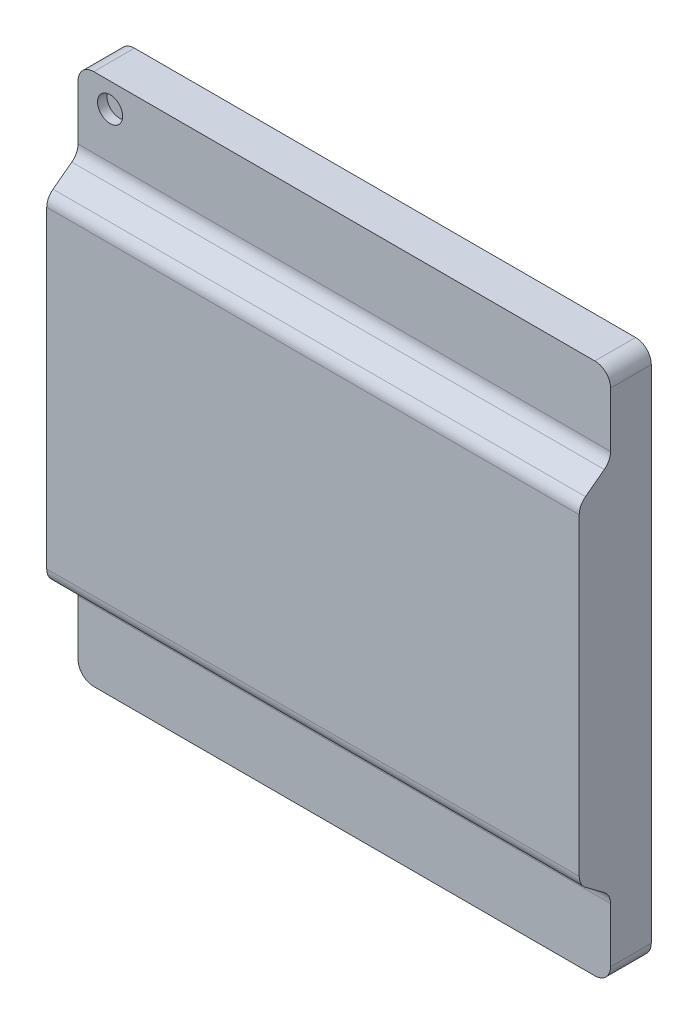
ISO-10303-21;
HEADER;
FILE_DESCRIPTION(('STEP AP214'),'2;1');
FILE_NAME('part.step','',(''),(''),'','','');
FILE_SCHEMA(('AUTOMOTIVE_DESIGN { 1 0 10303 214 1 1 1 1 }'));
ENDSEC;
DATA;
#1=APPLICATION_CONTEXT('core data for automotive mechanical design processes');
#2=APPLICATION_PROTOCOL_DEFINITION('international standard','automotive_design',2000,#1);
#3=PRODUCT_CONTEXT('',#1,'mechanical');
#4=PRODUCT('Part','Part','',(#3));
#5=PRODUCT_RELATED_PRODUCT_CATEGORY('part','',(#4));
#6=PRODUCT_DEFINITION_FORMATION('','',#4);
#7=PRODUCT_DEFINITION_CONTEXT('part definition',#1,'design');
#8=PRODUCT_DEFINITION('design','',#6,#7);
#9=PRODUCT_DEFINITION_SHAPE('','',#8);
#10=(LENGTH_UNIT() NAMED_UNIT(*) SI_UNIT(.MILLI.,.METRE.));
#11=(NAMED_UNIT(*) PLANE_ANGLE_UNIT() SI_UNIT($,.RADIAN.));
#12=(NAMED_UNIT(*) SI_UNIT($,.STERADIAN.) SOLID_ANGLE_UNIT());
#13=UNCERTAINTY_MEASURE_WITH_UNIT(LENGTH_MEASURE(1.E-05),#10,'distance_accuracy_value','');
#14=(GEOMETRIC_REPRESENTATION_CONTEXT(3) GLOBAL_UNCERTAINTY_ASSIGNED_CONTEXT((#13)) GLOBAL_UNIT_ASSIGNED_CONTEXT((#10,
#11,#12)) REPRESENTATION_CONTEXT('',''));
#15=CARTESIAN_POINT('',(0.,0.,0.));
#16=DIRECTION('',(0.,0.,1.));
#17=DIRECTION('',(1.,0.,0.));
#18=AXIS2_PLACEMENT_3D('',#15,#16,#17);
#19=CARTESIAN_POINT('',(69.47677453417,39.27481344731,-10.15));
#20=DIRECTION('',(1.,0.,0.));
#21=DIRECTION('',(0.,0.,-1.));
#22=AXIS2_PLACEMENT_3D('',#19,#20,#21);
#23=PLANE('',#22);
#24=DIRECTION('',(0.,-1.,0.));
#25=VECTOR('',#24,1.);
#26=CARTESIAN_POINT('',(69.47677453417,38.77481344731,-10.15));
#27=LINE('',#26,#25);
#28=CARTESIAN_POINT('',(69.47677453417,38.77481344731,-10.15));
#29=VERTEX_POINT('',#28);
#30=CARTESIAN_POINT('',(69.47677453417,22.77481344731,-10.15));
#31=VERTEX_POINT('',#30);
#32=EDGE_CURVE('E210',#29,#31,#27,.T.);
#33=ORIENTED_EDGE('',*,*,#32,.F.);
#34=DIRECTION('',(0.,0.,-1.));
#35=VECTOR('',#34,1.);
#36=CARTESIAN_POINT('',(69.47677453417,38.77481344731,-8.85));
#37=LINE('',#36,#35);
#38=CARTESIAN_POINT('',(69.47677453417,38.77481344731,-8.85));
#39=VERTEX_POINT('',#38);
#40=EDGE_CURVE('E36',#39,#29,#37,.T.);
#41=ORIENTED_EDGE('',*,*,#40,.F.);
#42=DIRECTION('',(0.,-1.,0.));
#43=VECTOR('',#42,1.);
#44=CARTESIAN_POINT('',(69.47677453417,38.77481344731,-8.85));
#45=LINE('',#44,#43);
#46=CARTESIAN_POINT('',(69.47677453417,37.02481344731,-8.85));
#47=VERTEX_POINT('',#46);
#48=EDGE_CURVE('E11',#39,#47,#45,.T.);
#49=ORIENTED_EDGE('',*,*,#48,.T.);
#50=CARTESIAN_POINT('',(69.47677453417,37.02481344731,-8.35));
#51=DIRECTION('',(-1.,0.,0.));
#52=DIRECTION('',(0.,0.,-1.));
#53=AXIS2_PLACEMENT_3D('',#50,#51,#52);
#54=CIRCLE('',#53,0.5);
#55=CARTESIAN_POINT('',(69.47677453417,36.62481344731,-8.65));
#56=VERTEX_POINT('',#55);
#57=EDGE_CURVE('E27',#47,#56,#54,.T.);
#58=ORIENTED_EDGE('',*,*,#57,.T.);
#59=DIRECTION('',(0.,-0.6,0.8));
#60=VECTOR('',#59,1.);
#61=CARTESIAN_POINT('',(69.47677453417,36.62481344731,-8.65));
#62=LINE('',#61,#60);
#63=CARTESIAN_POINT('',(69.47677453417,36.17481344731,-8.05));
#64=VERTEX_POINT('',#63);
#65=EDGE_CURVE('E281',#56,#64,#62,.T.);
#66=ORIENTED_EDGE('',*,*,#65,.T.);
#67=CARTESIAN_POINT('',(69.47677453417,35.77481344731,-8.35));
#68=DIRECTION('',(1.,0.,0.));
#69=DIRECTION('',(0.,0.8,0.6));
#70=AXIS2_PLACEMENT_3D('',#67,#68,#69);
#71=CIRCLE('',#70,0.5);
#72=CARTESIAN_POINT('',(69.47677453417,35.77481344731,-7.85));
#73=VERTEX_POINT('',#72);
#74=EDGE_CURVE('E279',#64,#73,#71,.T.);
#75=ORIENTED_EDGE('',*,*,#74,.T.);
#76=DIRECTION('',(0.,-1.,0.));
#77=VECTOR('',#76,1.);
#78=CARTESIAN_POINT('',(69.47677453417,35.77481344731,-7.85));
#79=LINE('',#78,#77);
#80=CARTESIAN_POINT('',(69.47677453417,25.77481344731,-7.85));
#81=VERTEX_POINT('',#80);
#82=EDGE_CURVE('E259',#73,#81,#79,.T.);
#83=ORIENTED_EDGE('',*,*,#82,.T.);
#84=CARTESIAN_POINT('',(69.47677453417,25.77481344731,-8.35));
#85=DIRECTION('',(1.,0.,0.));
#86=DIRECTION('',(0.,0.,1.));
#87=AXIS2_PLACEMENT_3D('',#84,#85,#86);
#88=CIRCLE('',#87,0.5);
#89=CARTESIAN_POINT('',(69.47677453417,25.37481344731,-8.05));
#90=VERTEX_POINT('',#89);
#91=EDGE_CURVE('E273',#81,#90,#88,.T.);
#92=ORIENTED_EDGE('',*,*,#91,.T.);
#93=DIRECTION('',(0.,-0.6,-0.8));
#94=VECTOR('',#93,1.);
#95=CARTESIAN_POINT('',(69.47677453417,25.37481344731,-8.05));
#96=LINE('',#95,#94);
#97=CARTESIAN_POINT('',(69.47677453417,24.92481344731,-8.65));
#98=VERTEX_POINT('',#97);
#99=EDGE_CURVE('E276',#90,#98,#96,.T.);
#100=ORIENTED_EDGE('',*,*,#99,.T.);
#101=CARTESIAN_POINT('',(69.47677453417,24.52481344731,-8.35));
#102=DIRECTION('',(-1.,0.,0.));
#103=DIRECTION('',(0.,0.8,-0.6));
#104=AXIS2_PLACEMENT_3D('',#101,#102,#103);
#105=CIRCLE('',#104,0.5);
#106=CARTESIAN_POINT('',(69.47677453417,24.52481344731,-8.85));
#107=VERTEX_POINT('',#106);
#108=EDGE_CURVE('E201',#98,#107,#105,.T.);
#109=ORIENTED_EDGE('',*,*,#108,.T.);
#110=DIRECTION('',(0.,1.,0.));
#111=VECTOR('',#110,1.);
#112=CARTESIAN_POINT('',(69.47677453417,22.77481344731,-8.85));
#113=LINE('',#112,#111);
#114=CARTESIAN_POINT('',(69.47677453417,22.77481344731,-8.85));
#115=VERTEX_POINT('',#114);
#116=EDGE_CURVE('E153',#115,#107,#113,.T.);
#117=ORIENTED_EDGE('',*,*,#116,.F.);
#118=DIRECTION('',(0.,0.,-1.));
#119=VECTOR('',#118,1.);
#120=CARTESIAN_POINT('',(69.47677453417,22.77481344731,-8.85));
#121=LINE('',#120,#119);
#122=EDGE_CURVE('E203',#115,#31,#121,.T.);
#123=ORIENTED_EDGE('',*,*,#122,.T.);
#124=EDGE_LOOP('',(#33,#41,#49,#58,#66,#75,#83,#92,#100,#109,#117,#123));
#125=FACE_BOUND('',#124,.T.);
#126=ADVANCED_FACE('F17',(#125),#23,.T.);
#127=CARTESIAN_POINT('',(68.97677453417,22.77481344731,-4.85172));
#128=DIRECTION('',(0.,0.,-1.));
#129=DIRECTION('',(1.,0.,0.));
#130=AXIS2_PLACEMENT_3D('',#127,#128,#129);
#131=CYLINDRICAL_SURFACE('',#130,0.5);
#132=ORIENTED_EDGE('',*,*,#122,.F.);
#133=CARTESIAN_POINT('',(68.97677453417,22.77481344731,-8.85));
#134=DIRECTION('',(0.,0.,1.));
#135=DIRECTION('',(0.,-1.,0.));
#136=AXIS2_PLACEMENT_3D('',#133,#134,#135);
#137=CIRCLE('',#136,0.5);
#138=CARTESIAN_POINT('',(68.97677453417,22.27481344731,-8.85));
#139=VERTEX_POINT('',#138);
#140=EDGE_CURVE('E144',#139,#115,#137,.T.);
#141=ORIENTED_EDGE('',*,*,#140,.F.);
#142=DIRECTION('',(0.,0.,-1.));
#143=VECTOR('',#142,1.);
#144=CARTESIAN_POINT('',(68.97677453417,22.27481344731,-8.85));
#145=LINE('',#144,#143);
#146=CARTESIAN_POINT('',(68.97677453417,22.27481344731,-10.15));
#147=VERTEX_POINT('',#146);
#148=EDGE_CURVE('E140',#139,#147,#145,.T.);
#149=ORIENTED_EDGE('',*,*,#148,.T.);
#150=CARTESIAN_POINT('',(68.97677453417,22.77481344731,-10.15));
#151=DIRECTION('',(0.,0.,-1.));
#152=DIRECTION('',(1.,0.,0.));
#153=AXIS2_PLACEMENT_3D('',#150,#151,#152);
#154=CIRCLE('',#153,0.5);
#155=EDGE_CURVE('E208',#31,#147,#154,.T.);
#156=ORIENTED_EDGE('',*,*,#155,.F.);
#157=EDGE_LOOP('',(#132,#141,#149,#156));
#158=FACE_BOUND('',#157,.T.);
#159=ADVANCED_FACE('F294',(#158),#131,.T.);
#160=CARTESIAN_POINT('',(49.99345093786,14.29155013054,-10.15));
#161=DIRECTION('',(0.,0.,1.));
#162=DIRECTION('',(1.,0.,0.));
#163=AXIS2_PLACEMENT_3D('',#160,#161,#162);
#164=PLANE('',#163);
#165=DIRECTION('',(-1.,0.,0.));
#166=VECTOR('',#165,1.);
#167=CARTESIAN_POINT('',(68.97677453417,22.27481344731,-10.15));
#168=LINE('',#167,#166);
#169=CARTESIAN_POINT('',(52.97677453417,22.27481344731,-10.15));
#170=VERTEX_POINT('',#169);
#171=EDGE_CURVE('E207',#147,#170,#168,.T.);
#172=ORIENTED_EDGE('',*,*,#171,.T.);
#173=CARTESIAN_POINT('',(52.97677453417,22.77481344731,-10.15));
#174=DIRECTION('',(0.,0.,-1.));
#175=DIRECTION('',(0.,-1.,0.));
#176=AXIS2_PLACEMENT_3D('',#173,#174,#175);
#177=CIRCLE('',#176,0.5);
#178=CARTESIAN_POINT('',(52.47677453417,22.77481344731,-10.15));
#179=VERTEX_POINT('',#178);
#180=EDGE_CURVE('E156',#170,#179,#177,.T.);
#181=ORIENTED_EDGE('',*,*,#180,.T.);
#182=DIRECTION('',(0.,1.,0.));
#183=VECTOR('',#182,1.);
#184=CARTESIAN_POINT('',(52.47677453417,22.77481344731,-10.15));
#185=LINE('',#184,#183);
#186=CARTESIAN_POINT('',(52.47677453417,38.77481344731,-10.15));
#187=VERTEX_POINT('',#186);
#188=EDGE_CURVE('E213',#179,#187,#185,.T.);
#189=ORIENTED_EDGE('',*,*,#188,.T.);
#190=CARTESIAN_POINT('',(52.97677453417,38.77481344731,-10.15));
#191=DIRECTION('',(0.,0.,-1.));
#192=DIRECTION('',(-1.,0.,0.));
#193=AXIS2_PLACEMENT_3D('',#190,#191,#192);
#194=CIRCLE('',#193,0.5);
#195=CARTESIAN_POINT('',(52.97677453417,39.27481344731,-10.15));
#196=VERTEX_POINT('',#195);
#197=EDGE_CURVE('E216',#187,#196,#194,.T.);
#198=ORIENTED_EDGE('',*,*,#197,.T.);
#199=DIRECTION('',(1.,0.,0.));
#200=VECTOR('',#199,1.);
#201=CARTESIAN_POINT('',(52.97677453417,39.27481344731,-10.15));
#202=LINE('',#201,#200);
#203=CARTESIAN_POINT('',(68.97677453417,39.27481344731,-10.15));
#204=VERTEX_POINT('',#203);
#205=EDGE_CURVE('E219',#196,#204,#202,.T.);
#206=ORIENTED_EDGE('',*,*,#205,.T.);
#207=CARTESIAN_POINT('',(68.97677453417,38.77481344731,-10.15));
#208=DIRECTION('',(0.,0.,-1.));
#209=DIRECTION('',(0.,1.,0.));
#210=AXIS2_PLACEMENT_3D('',#207,#208,#209);
#211=CIRCLE('',#210,0.5);
#212=EDGE_CURVE('E222',#204,#29,#211,.T.);
#213=ORIENTED_EDGE('',*,*,#212,.T.);
#214=ORIENTED_EDGE('',*,*,#32,.T.);
#215=ORIENTED_EDGE('',*,*,#155,.T.);
#216=EDGE_LOOP('',(#172,#181,#189,#198,#206,#213,#214,#215));
#217=FACE_BOUND('',#216,.T.);
#218=ADVANCED_FACE('F291',(#217),#164,.F.);
#219=CARTESIAN_POINT('',(68.97677453417,38.77481344731,-4.85172));
#220=DIRECTION('',(0.,0.,-1.));
#221=DIRECTION('',(0.,1.,0.));
#222=AXIS2_PLACEMENT_3D('',#219,#220,#221);
#223=CYLINDRICAL_SURFACE('',#222,0.5);
#224=DIRECTION('',(0.,0.,-1.));
#225=VECTOR('',#224,1.);
#226=CARTESIAN_POINT('',(68.97677453417,39.27481344731,-8.85));
#227=LINE('',#226,#225);
#228=CARTESIAN_POINT('',(68.97677453417,39.27481344731,-8.85));
#229=VERTEX_POINT('',#228);
#230=EDGE_CURVE('E177',#229,#204,#227,.T.);
#231=ORIENTED_EDGE('',*,*,#230,.F.);
#232=CARTESIAN_POINT('',(68.97677453417,38.77481344731,-8.85));
#233=DIRECTION('',(0.,0.,1.));
#234=DIRECTION('',(1.,0.,0.));
#235=AXIS2_PLACEMENT_3D('',#232,#233,#234);
#236=CIRCLE('',#235,0.5);
#237=EDGE_CURVE('E227',#39,#229,#236,.T.);
#238=ORIENTED_EDGE('',*,*,#237,.F.);
#239=ORIENTED_EDGE('',*,*,#40,.T.);
#240=ORIENTED_EDGE('',*,*,#212,.F.);
#241=EDGE_LOOP('',(#231,#238,#239,#240));
#242=FACE_BOUND('',#241,.T.);
#243=ADVANCED_FACE('F297',(#242),#223,.T.);
#244=CARTESIAN_POINT('',(52.47677453417,39.27481344731,-8.85));
#245=DIRECTION('',(0.,0.,-1.));
#246=DIRECTION('',(0.,-1.,0.));
#247=AXIS2_PLACEMENT_3D('',#244,#245,#246);
#248=PLANE('',#247);
#249=DIRECTION('',(1.,0.,0.));
#250=VECTOR('',#249,1.);
#251=CARTESIAN_POINT('',(52.97677453417,39.27481344731,-8.85));
#252=LINE('',#251,#250);
#253=CARTESIAN_POINT('',(52.97677453417,39.27481344731,-8.85));
#254=VERTEX_POINT('',#253);
#255=EDGE_CURVE('E186',#254,#229,#252,.T.);
#256=ORIENTED_EDGE('',*,*,#255,.F.);
#257=CARTESIAN_POINT('',(52.97677453417,38.77481344731,-8.85));
#258=DIRECTION('',(0.,0.,1.));
#259=DIRECTION('',(0.,1.,0.));
#260=AXIS2_PLACEMENT_3D('',#257,#258,#259);
#261=CIRCLE('',#260,0.5);
#262=CARTESIAN_POINT('',(52.47677453417,38.77481344731,-8.85));
#263=VERTEX_POINT('',#262);
#264=EDGE_CURVE('E234',#254,#263,#261,.T.);
#265=ORIENTED_EDGE('',*,*,#264,.T.);
#266=DIRECTION('',(0.,-1.,0.));
#267=VECTOR('',#266,1.);
#268=CARTESIAN_POINT('',(52.47677453417,38.77481344731,-8.85));
#269=LINE('',#268,#267);
#270=CARTESIAN_POINT('',(52.47677453417,37.02481344731,-8.85));
#271=VERTEX_POINT('',#270);
#272=EDGE_CURVE('E237',#263,#271,#269,.T.);
#273=ORIENTED_EDGE('',*,*,#272,.T.);
#274=DIRECTION('',(1.,0.,0.));
#275=VECTOR('',#274,1.);
#276=CARTESIAN_POINT('',(52.47677453417,37.02481344731,-8.85));
#277=LINE('',#276,#275);
#278=EDGE_CURVE('E230',#271,#47,#277,.T.);
#279=ORIENTED_EDGE('',*,*,#278,.T.);
#280=ORIENTED_EDGE('',*,*,#48,.F.);
#281=ORIENTED_EDGE('',*,*,#237,.T.);
#282=EDGE_LOOP('',(#256,#265,#273,#279,#280,#281));
#283=FACE_BOUND('',#282,.T.);
#284=CARTESIAN_POINT('',(53.5,38.5,-8.85));
#285=DIRECTION('',(0.,0.,1.));
#286=DIRECTION('',(0.,1.,0.));
#287=AXIS2_PLACEMENT_3D('',#284,#285,#286);
#288=CIRCLE('',#287,0.4);
#289=CARTESIAN_POINT('',(53.5,38.9,-8.85));
#290=VERTEX_POINT('',#289);
#291=EDGE_CURVE('E231',#290,#290,#288,.T.);
#292=ORIENTED_EDGE('',*,*,#291,.F.);
#293=EDGE_LOOP('',(#292));
#294=FACE_BOUND('',#293,.T.);
#295=ADVANCED_FACE('F300',(#283,#294),#248,.F.);
#296=CARTESIAN_POINT('',(53.5,38.5,-8.85));
#297=DIRECTION('',(0.,0.,1.));
#298=DIRECTION('',(0.,-1.,0.));
#299=AXIS2_PLACEMENT_3D('',#296,#297,#298);
#300=CYLINDRICAL_SURFACE('',#299,0.4);
#301=CARTESIAN_POINT('',(53.5,38.5,-9.15));
#302=DIRECTION('',(0.,0.,1.));
#303=DIRECTION('',(0.,-1.,0.));
#304=AXIS2_PLACEMENT_3D('',#301,#302,#303);
#305=CIRCLE('',#304,0.4);
#306=CARTESIAN_POINT('',(53.5,38.1,-9.15));
#307=VERTEX_POINT('',#306);
#308=EDGE_CURVE('E244',#307,#307,#305,.T.);
#309=ORIENTED_EDGE('',*,*,#308,.F.);
#310=EDGE_LOOP('',(#309));
#311=FACE_BOUND('',#310,.T.);
#312=ORIENTED_EDGE('',*,*,#291,.T.);
#313=EDGE_LOOP('',(#312));
#314=FACE_BOUND('',#313,.T.);
#315=ADVANCED_FACE('F338',(#311,#314),#300,.F.);
#316=CARTESIAN_POINT('',(52.47677453417,0.,-9.15));
#317=DIRECTION('',(0.,0.,1.));
#318=DIRECTION('',(0.,-1.,0.));
#319=AXIS2_PLACEMENT_3D('',#316,#317,#318);
#320=PLANE('',#319);
#321=ORIENTED_EDGE('',*,*,#308,.T.);
#322=EDGE_LOOP('',(#321));
#323=FACE_BOUND('',#322,.T.);
#324=ADVANCED_FACE('F323',(#323),#320,.T.);
#325=CARTESIAN_POINT('',(30.31557453417,37.02481344731,-8.35));
#326=DIRECTION('',(1.,0.,0.));
#327=DIRECTION('',(0.,-0.8,-0.6));
#328=AXIS2_PLACEMENT_3D('',#325,#326,#327);
#329=CYLINDRICAL_SURFACE('',#328,0.5);
#330=ORIENTED_EDGE('',*,*,#57,.F.);
#331=ORIENTED_EDGE('',*,*,#278,.F.);
#332=CARTESIAN_POINT('',(52.47677453417,37.02481344731,-8.35));
#333=DIRECTION('',(1.,0.,0.));
#334=DIRECTION('',(0.,-0.8,-0.6));
#335=AXIS2_PLACEMENT_3D('',#332,#333,#334);
#336=CIRCLE('',#335,0.5);
#337=CARTESIAN_POINT('',(52.47677453417,36.62481344731,-8.65));
#338=VERTEX_POINT('',#337);
#339=EDGE_CURVE('E182',#338,#271,#336,.T.);
#340=ORIENTED_EDGE('',*,*,#339,.F.);
#341=DIRECTION('',(1.,0.,0.));
#342=VECTOR('',#341,1.);
#343=CARTESIAN_POINT('',(52.47677453417,36.62481344731,-8.65));
#344=LINE('',#343,#342);
#345=EDGE_CURVE('E247',#338,#56,#344,.T.);
#346=ORIENTED_EDGE('',*,*,#345,.T.);
#347=EDGE_LOOP('',(#330,#331,#340,#346));
#348=FACE_BOUND('',#347,.T.);
#349=ADVANCED_FACE('F309',(#348),#329,.F.);
#350=CARTESIAN_POINT('',(52.47677453417,36.77481344731,-8.85));
#351=DIRECTION('',(0.,-0.8,-0.6));
#352=DIRECTION('',(0.,-0.6,0.8));
#353=AXIS2_PLACEMENT_3D('',#350,#351,#352);
#354=PLANE('',#353);
#355=ORIENTED_EDGE('',*,*,#65,.F.);
#356=ORIENTED_EDGE('',*,*,#345,.F.);
#357=DIRECTION('',(0.,-0.6,0.8));
#358=VECTOR('',#357,1.);
#359=CARTESIAN_POINT('',(52.47677453417,36.62481344731,-8.65));
#360=LINE('',#359,#358);
#361=CARTESIAN_POINT('',(52.47677453417,36.17481344731,-8.05));
#362=VERTEX_POINT('',#361);
#363=EDGE_CURVE('E252',#338,#362,#360,.T.);
#364=ORIENTED_EDGE('',*,*,#363,.T.);
#365=DIRECTION('',(-1.,0.,0.));
#366=VECTOR('',#365,1.);
#367=CARTESIAN_POINT('',(69.47677453417,36.17481344731,-8.05));
#368=LINE('',#367,#366);
#369=EDGE_CURVE('E166',#64,#362,#368,.T.);
#370=ORIENTED_EDGE('',*,*,#369,.F.);
#371=EDGE_LOOP('',(#355,#356,#364,#370));
#372=FACE_BOUND('',#371,.T.);
#373=ADVANCED_FACE('F311',(#372),#354,.F.);
#374=CARTESIAN_POINT('',(91.63797453417,35.77481344731,-8.35));
#375=DIRECTION('',(-1.,0.,0.));
#376=DIRECTION('',(0.,0.,1.));
#377=AXIS2_PLACEMENT_3D('',#374,#375,#376);
#378=CYLINDRICAL_SURFACE('',#377,0.5);
#379=DIRECTION('',(-1.,0.,0.));
#380=VECTOR('',#379,1.);
#381=CARTESIAN_POINT('',(69.47677453417,35.77481344731,-7.85));
#382=LINE('',#381,#380);
#383=CARTESIAN_POINT('',(52.47677453417,35.77481344731,-7.85));
#384=VERTEX_POINT('',#383);
#385=EDGE_CURVE('E178',#73,#384,#382,.T.);
#386=ORIENTED_EDGE('',*,*,#385,.F.);
#387=ORIENTED_EDGE('',*,*,#74,.F.);
#388=ORIENTED_EDGE('',*,*,#369,.T.);
#389=CARTESIAN_POINT('',(52.47677453417,35.77481344731,-8.35));
#390=DIRECTION('',(-1.,0.,0.));
#391=DIRECTION('',(0.,0.,1.));
#392=AXIS2_PLACEMENT_3D('',#389,#390,#391);
#393=CIRCLE('',#392,0.5);
#394=EDGE_CURVE('E163',#384,#362,#393,.T.);
#395=ORIENTED_EDGE('',*,*,#394,.F.);
#396=EDGE_LOOP('',(#386,#387,#388,#395));
#397=FACE_BOUND('',#396,.T.);
#398=ADVANCED_FACE('F263',(#397),#378,.T.);
#399=CARTESIAN_POINT('',(52.47677453417,22.27481344731,-10.15));
#400=DIRECTION('',(-1.,0.,0.));
#401=DIRECTION('',(0.,0.,1.));
#402=AXIS2_PLACEMENT_3D('',#399,#400,#401);
#403=PLANE('',#402);
#404=ORIENTED_EDGE('',*,*,#188,.F.);
#405=DIRECTION('',(0.,0.,-1.));
#406=VECTOR('',#405,1.);
#407=CARTESIAN_POINT('',(52.47677453417,22.77481344731,-8.85));
#408=LINE('',#407,#406);
#409=CARTESIAN_POINT('',(52.47677453417,22.77481344731,-8.85));
#410=VERTEX_POINT('',#409);
#411=EDGE_CURVE('E158',#410,#179,#408,.T.);
#412=ORIENTED_EDGE('',*,*,#411,.F.);
#413=DIRECTION('',(0.,1.,0.));
#414=VECTOR('',#413,1.);
#415=CARTESIAN_POINT('',(52.47677453417,22.77481344731,-8.85));
#416=LINE('',#415,#414);
#417=CARTESIAN_POINT('',(52.47677453417,24.52481344731,-8.85));
#418=VERTEX_POINT('',#417);
#419=EDGE_CURVE('E150',#410,#418,#416,.T.);
#420=ORIENTED_EDGE('',*,*,#419,.T.);
#421=CARTESIAN_POINT('',(52.47677453417,24.52481344731,-8.35));
#422=DIRECTION('',(1.,0.,0.));
#423=DIRECTION('',(0.,0.,-1.));
#424=AXIS2_PLACEMENT_3D('',#421,#422,#423);
#425=CIRCLE('',#424,0.5);
#426=CARTESIAN_POINT('',(52.47677453417,24.92481344731,-8.65));
#427=VERTEX_POINT('',#426);
#428=EDGE_CURVE('E167',#418,#427,#425,.T.);
#429=ORIENTED_EDGE('',*,*,#428,.T.);
#430=DIRECTION('',(0.,-0.6,-0.8));
#431=VECTOR('',#430,1.);
#432=CARTESIAN_POINT('',(52.47677453417,25.37481344731,-8.05));
#433=LINE('',#432,#431);
#434=CARTESIAN_POINT('',(52.47677453417,25.37481344731,-8.05));
#435=VERTEX_POINT('',#434);
#436=EDGE_CURVE('E171',#435,#427,#433,.T.);
#437=ORIENTED_EDGE('',*,*,#436,.F.);
#438=CARTESIAN_POINT('',(52.47677453417,25.77481344731,-8.35));
#439=DIRECTION('',(-1.,0.,0.));
#440=DIRECTION('',(0.,-0.8,0.6));
#441=AXIS2_PLACEMENT_3D('',#438,#439,#440);
#442=CIRCLE('',#441,0.5);
#443=CARTESIAN_POINT('',(52.47677453417,25.77481344731,-7.85));
#444=VERTEX_POINT('',#443);
#445=EDGE_CURVE('E170',#435,#444,#442,.T.);
#446=ORIENTED_EDGE('',*,*,#445,.T.);
#447=DIRECTION('',(0.,-1.,0.));
#448=VECTOR('',#447,1.);
#449=CARTESIAN_POINT('',(52.47677453417,35.77481344731,-7.85));
#450=LINE('',#449,#448);
#451=EDGE_CURVE('E127',#384,#444,#450,.T.);
#452=ORIENTED_EDGE('',*,*,#451,.F.);
#453=ORIENTED_EDGE('',*,*,#394,.T.);
#454=ORIENTED_EDGE('',*,*,#363,.F.);
#455=ORIENTED_EDGE('',*,*,#339,.T.);
#456=ORIENTED_EDGE('',*,*,#272,.F.);
#457=DIRECTION('',(0.,0.,-1.));
#458=VECTOR('',#457,1.);
#459=CARTESIAN_POINT('',(52.47677453417,38.77481344731,-8.85));
#460=LINE('',#459,#458);
#461=EDGE_CURVE('E179',#263,#187,#460,.T.);
#462=ORIENTED_EDGE('',*,*,#461,.T.);
#463=EDGE_LOOP('',(#404,#412,#420,#429,#437,#446,#452,#453,#454,#455,#456,#462));
#464=FACE_BOUND('',#463,.T.);
#465=ADVANCED_FACE('F267',(#464),#403,.T.);
#466=CARTESIAN_POINT('',(52.97677453417,38.77481344731,-4.85172));
#467=DIRECTION('',(0.,0.,-1.));
#468=DIRECTION('',(-1.,0.,0.));
#469=AXIS2_PLACEMENT_3D('',#466,#467,#468);
#470=CYLINDRICAL_SURFACE('',#469,0.5);
#471=ORIENTED_EDGE('',*,*,#461,.F.);
#472=ORIENTED_EDGE('',*,*,#264,.F.);
#473=DIRECTION('',(0.,0.,-1.));
#474=VECTOR('',#473,1.);
#475=CARTESIAN_POINT('',(52.97677453417,39.27481344731,-8.85));
#476=LINE('',#475,#474);
#477=EDGE_CURVE('E183',#254,#196,#476,.T.);
#478=ORIENTED_EDGE('',*,*,#477,.T.);
#479=ORIENTED_EDGE('',*,*,#197,.F.);
#480=EDGE_LOOP('',(#471,#472,#478,#479));
#481=FACE_BOUND('',#480,.T.);
#482=ADVANCED_FACE('F306',(#481),#470,.T.);
#483=CARTESIAN_POINT('',(52.47677453417,39.27481344731,-10.15));
#484=DIRECTION('',(0.,1.,0.));
#485=DIRECTION('',(0.,0.,1.));
#486=AXIS2_PLACEMENT_3D('',#483,#484,#485);
#487=PLANE('',#486);
#488=ORIENTED_EDGE('',*,*,#205,.F.);
#489=ORIENTED_EDGE('',*,*,#477,.F.);
#490=ORIENTED_EDGE('',*,*,#255,.T.);
#491=ORIENTED_EDGE('',*,*,#230,.T.);
#492=EDGE_LOOP('',(#488,#489,#490,#491));
#493=FACE_BOUND('',#492,.T.);
#494=ADVANCED_FACE('F304',(#493),#487,.T.);
#495=CARTESIAN_POINT('',(52.47677453417,36.02481344731,-7.85));
#496=DIRECTION('',(0.,0.,-1.));
#497=DIRECTION('',(0.,-1.,0.));
#498=AXIS2_PLACEMENT_3D('',#495,#496,#497);
#499=PLANE('',#498);
#500=ORIENTED_EDGE('',*,*,#451,.T.);
#501=DIRECTION('',(-1.,0.,0.));
#502=VECTOR('',#501,1.);
#503=CARTESIAN_POINT('',(69.47677453417,25.77481344731,-7.85));
#504=LINE('',#503,#502);
#505=EDGE_CURVE('E173',#81,#444,#504,.T.);
#506=ORIENTED_EDGE('',*,*,#505,.F.);
#507=ORIENTED_EDGE('',*,*,#82,.F.);
#508=ORIENTED_EDGE('',*,*,#385,.T.);
#509=EDGE_LOOP('',(#500,#506,#507,#508));
#510=FACE_BOUND('',#509,.T.);
#511=ADVANCED_FACE('F257',(#510),#499,.F.);
#512=CARTESIAN_POINT('',(91.63797453417,25.77481344731,-8.35));
#513=DIRECTION('',(-1.,0.,0.));
#514=DIRECTION('',(0.,-0.8,0.6));
#515=AXIS2_PLACEMENT_3D('',#512,#513,#514);
#516=CYLINDRICAL_SURFACE('',#515,0.5);
#517=DIRECTION('',(-1.,0.,0.));
#518=VECTOR('',#517,1.);
#519=CARTESIAN_POINT('',(69.47677453417,25.37481344731,-8.05));
#520=LINE('',#519,#518);
#521=EDGE_CURVE('E189',#90,#435,#520,.T.);
#522=ORIENTED_EDGE('',*,*,#521,.F.);
#523=ORIENTED_EDGE('',*,*,#91,.F.);
#524=ORIENTED_EDGE('',*,*,#505,.T.);
#525=ORIENTED_EDGE('',*,*,#445,.F.);
#526=EDGE_LOOP('',(#522,#523,#524,#525));
#527=FACE_BOUND('',#526,.T.);
#528=ADVANCED_FACE('F271',(#527),#516,.T.);
#529=CARTESIAN_POINT('',(52.47677453417,25.52481344731,-7.85));
#530=DIRECTION('',(0.,0.8,-0.6));
#531=DIRECTION('',(0.,-0.6,-0.8));
#532=AXIS2_PLACEMENT_3D('',#529,#530,#531);
#533=PLANE('',#532);
#534=ORIENTED_EDGE('',*,*,#436,.T.);
#535=DIRECTION('',(1.,0.,0.));
#536=VECTOR('',#535,1.);
#537=CARTESIAN_POINT('',(52.47677453417,24.92481344731,-8.65));
#538=LINE('',#537,#536);
#539=EDGE_CURVE('E174',#427,#98,#538,.T.);
#540=ORIENTED_EDGE('',*,*,#539,.T.);
#541=ORIENTED_EDGE('',*,*,#99,.F.);
#542=ORIENTED_EDGE('',*,*,#521,.T.);
#543=EDGE_LOOP('',(#534,#540,#541,#542));
#544=FACE_BOUND('',#543,.T.);
#545=ADVANCED_FACE('F288',(#544),#533,.F.);
#546=CARTESIAN_POINT('',(30.31557453417,24.52481344731,-8.35));
#547=DIRECTION('',(1.,0.,0.));
#548=DIRECTION('',(0.,0.,-1.));
#549=AXIS2_PLACEMENT_3D('',#546,#547,#548);
#550=CYLINDRICAL_SURFACE('',#549,0.5);
#551=ORIENTED_EDGE('',*,*,#108,.F.);
#552=ORIENTED_EDGE('',*,*,#539,.F.);
#553=ORIENTED_EDGE('',*,*,#428,.F.);
#554=DIRECTION('',(1.,0.,0.));
#555=VECTOR('',#554,1.);
#556=CARTESIAN_POINT('',(52.47677453417,24.52481344731,-8.85));
#557=LINE('',#556,#555);
#558=EDGE_CURVE('E192',#418,#107,#557,.T.);
#559=ORIENTED_EDGE('',*,*,#558,.T.);
#560=EDGE_LOOP('',(#551,#552,#553,#559));
#561=FACE_BOUND('',#560,.T.);
#562=ADVANCED_FACE('F286',(#561),#550,.F.);
#563=CARTESIAN_POINT('',(52.47677453417,24.77481344731,-8.85));
#564=DIRECTION('',(0.,0.,-1.));
#565=DIRECTION('',(0.,-1.,0.));
#566=AXIS2_PLACEMENT_3D('',#563,#564,#565);
#567=PLANE('',#566);
#568=ORIENTED_EDGE('',*,*,#116,.T.);
#569=ORIENTED_EDGE('',*,*,#558,.F.);
#570=ORIENTED_EDGE('',*,*,#419,.F.);
#571=CARTESIAN_POINT('',(52.97677453417,22.77481344731,-8.85));
#572=DIRECTION('',(0.,0.,1.));
#573=DIRECTION('',(-1.,0.,0.));
#574=AXIS2_PLACEMENT_3D('',#571,#572,#573);
#575=CIRCLE('',#574,0.5);
#576=CARTESIAN_POINT('',(52.97677453417,22.27481344731,-8.85));
#577=VERTEX_POINT('',#576);
#578=EDGE_CURVE('E143',#410,#577,#575,.T.);
#579=ORIENTED_EDGE('',*,*,#578,.T.);
#580=DIRECTION('',(1.,0.,0.));
#581=VECTOR('',#580,1.);
#582=CARTESIAN_POINT('',(52.97677453417,22.27481344731,-8.85));
#583=LINE('',#582,#581);
#584=EDGE_CURVE('E134',#577,#139,#583,.T.);
#585=ORIENTED_EDGE('',*,*,#584,.T.);
#586=ORIENTED_EDGE('',*,*,#140,.T.);
#587=EDGE_LOOP('',(#568,#569,#570,#579,#585,#586));
#588=FACE_BOUND('',#587,.T.);
#589=ADVANCED_FACE('F147',(#588),#567,.F.);
#590=CARTESIAN_POINT('',(69.47677453417,22.27481344731,-10.15));
#591=DIRECTION('',(0.,-1.,0.));
#592=DIRECTION('',(0.,0.,-1.));
#593=AXIS2_PLACEMENT_3D('',#590,#591,#592);
#594=PLANE('',#593);
#595=ORIENTED_EDGE('',*,*,#584,.F.);
#596=DIRECTION('',(0.,0.,-1.));
#597=VECTOR('',#596,1.);
#598=CARTESIAN_POINT('',(52.97677453417,22.27481344731,-8.85));
#599=LINE('',#598,#597);
#600=EDGE_CURVE('E21',#577,#170,#599,.T.);
#601=ORIENTED_EDGE('',*,*,#600,.T.);
#602=ORIENTED_EDGE('',*,*,#171,.F.);
#603=ORIENTED_EDGE('',*,*,#148,.F.);
#604=EDGE_LOOP('',(#595,#601,#602,#603));
#605=FACE_BOUND('',#604,.T.);
#606=ADVANCED_FACE('F136',(#605),#594,.T.);
#607=CARTESIAN_POINT('',(52.97677453417,22.77481344731,-4.85172));
#608=DIRECTION('',(0.,0.,-1.));
#609=DIRECTION('',(0.,-1.,0.));
#610=AXIS2_PLACEMENT_3D('',#607,#608,#609);
#611=CYLINDRICAL_SURFACE('',#610,0.5);
#612=ORIENTED_EDGE('',*,*,#600,.F.);
#613=ORIENTED_EDGE('',*,*,#578,.F.);
#614=ORIENTED_EDGE('',*,*,#411,.T.);
#615=ORIENTED_EDGE('',*,*,#180,.F.);
#616=EDGE_LOOP('',(#612,#613,#614,#615));
#617=FACE_BOUND('',#616,.T.);
#618=ADVANCED_FACE('F19',(#617),#611,.T.);
#619=CLOSED_SHELL('',(#126,#159,#218,#243,#295,#315,#324,#349,#373,#398,#465,#482,#494,#511,
#528,#545,#562,#589,#606,#618));
#620=MANIFOLD_SOLID_BREP('B1',#619);
#621=ADVANCED_BREP_SHAPE_REPRESENTATION('',(#18,#620),#14);
#622=SHAPE_DEFINITION_REPRESENTATION(#9,#621);
ENDSEC;
END-ISO-10303-21;
